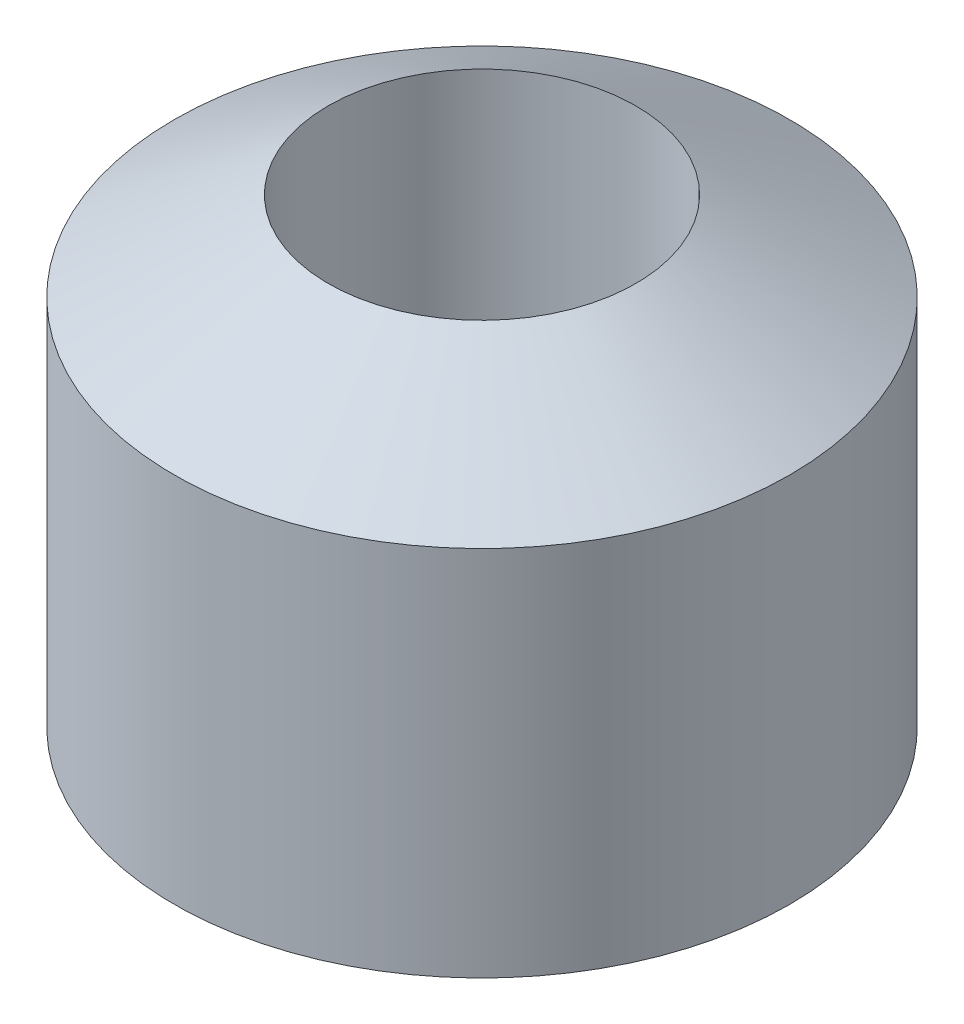
ISO-10303-21;
HEADER;
FILE_DESCRIPTION(('STEP AP214'),'2;1');
FILE_NAME('part.step','',(''),(''),'','','');
FILE_SCHEMA(('AUTOMOTIVE_DESIGN { 1 0 10303 214 1 1 1 1 }'));
ENDSEC;
DATA;
#1=APPLICATION_CONTEXT('core data for automotive mechanical design processes');
#2=APPLICATION_PROTOCOL_DEFINITION('international standard','automotive_design',2000,#1);
#3=PRODUCT_CONTEXT('',#1,'mechanical');
#4=PRODUCT('Part','Part','',(#3));
#5=PRODUCT_RELATED_PRODUCT_CATEGORY('part','',(#4));
#6=PRODUCT_DEFINITION_FORMATION('','',#4);
#7=PRODUCT_DEFINITION_CONTEXT('part definition',#1,'design');
#8=PRODUCT_DEFINITION('design','',#6,#7);
#9=PRODUCT_DEFINITION_SHAPE('','',#8);
#10=(LENGTH_UNIT() NAMED_UNIT(*) SI_UNIT(.MILLI.,.METRE.));
#11=(NAMED_UNIT(*) PLANE_ANGLE_UNIT() SI_UNIT($,.RADIAN.));
#12=(NAMED_UNIT(*) SI_UNIT($,.STERADIAN.) SOLID_ANGLE_UNIT());
#13=UNCERTAINTY_MEASURE_WITH_UNIT(LENGTH_MEASURE(1.E-05),#10,'distance_accuracy_value','');
#14=(GEOMETRIC_REPRESENTATION_CONTEXT(3) GLOBAL_UNCERTAINTY_ASSIGNED_CONTEXT((#13)) GLOBAL_UNIT_ASSIGNED_CONTEXT((#10,
#11,#12)) REPRESENTATION_CONTEXT('',''));
#15=CARTESIAN_POINT('',(0.,0.,0.));
#16=DIRECTION('',(0.,0.,1.));
#17=DIRECTION('',(1.,0.,0.));
#18=AXIS2_PLACEMENT_3D('',#15,#16,#17);
#19=CARTESIAN_POINT('',(0.,41.9170962313452,0.));
#20=DIRECTION('',(0.,-1.,0.));
#21=DIRECTION('',(1.,0.,0.));
#22=AXIS2_PLACEMENT_3D('',#19,#20,#21);
#23=CONICAL_SURFACE('',#22,28.,1.04719755119659);
#24=CARTESIAN_POINT('',(0.,50.,0.));
#25=DIRECTION('',(0.,1.,0.));
#26=DIRECTION('',(-1.,0.,0.));
#27=AXIS2_PLACEMENT_3D('',#24,#25,#26);
#28=CIRCLE('',#27,14.);
#29=CARTESIAN_POINT('',(-14.,50.,0.));
#30=VERTEX_POINT('',#29);
#31=EDGE_CURVE('E10',#30,#30,#28,.T.);
#32=ORIENTED_EDGE('',*,*,#31,.F.);
#33=EDGE_LOOP('',(#32));
#34=FACE_BOUND('',#33,.T.);
#35=CARTESIAN_POINT('',(0.,41.9170962313452,0.));
#36=DIRECTION('',(0.,1.,0.));
#37=DIRECTION('',(-1.,0.,0.));
#38=AXIS2_PLACEMENT_3D('',#35,#36,#37);
#39=CIRCLE('',#38,28.);
#40=CARTESIAN_POINT('',(-28.,41.9170962313452,0.));
#41=VERTEX_POINT('',#40);
#42=EDGE_CURVE('E51',#41,#41,#39,.T.);
#43=ORIENTED_EDGE('',*,*,#42,.T.);
#44=EDGE_LOOP('',(#43));
#45=FACE_BOUND('',#44,.T.);
#46=ADVANCED_FACE('F37',(#34,#45),#23,.T.);
#47=CARTESIAN_POINT('',(0.,3.98022562253338,0.));
#48=DIRECTION('',(0.,1.,0.));
#49=DIRECTION('',(-1.,0.,0.));
#50=AXIS2_PLACEMENT_3D('',#47,#48,#49);
#51=CYLINDRICAL_SURFACE('',#50,14.);
#52=CARTESIAN_POINT('',(0.,0.,0.));
#53=DIRECTION('',(0.,1.,0.));
#54=DIRECTION('',(-1.,0.,0.));
#55=AXIS2_PLACEMENT_3D('',#52,#53,#54);
#56=CIRCLE('',#55,14.);
#57=CARTESIAN_POINT('',(-14.,0.,0.));
#58=VERTEX_POINT('',#57);
#59=EDGE_CURVE('E43',#58,#58,#56,.T.);
#60=ORIENTED_EDGE('',*,*,#59,.F.);
#61=EDGE_LOOP('',(#60));
#62=FACE_BOUND('',#61,.T.);
#63=ORIENTED_EDGE('',*,*,#31,.T.);
#64=EDGE_LOOP('',(#63));
#65=FACE_BOUND('',#64,.T.);
#66=ADVANCED_FACE('F66',(#62,#65),#51,.F.);
#67=CARTESIAN_POINT('',(0.,0.,0.));
#68=DIRECTION('',(0.,1.,0.));
#69=DIRECTION('',(-1.,0.,0.));
#70=AXIS2_PLACEMENT_3D('',#67,#68,#69);
#71=CONICAL_SURFACE('',#70,14.,1.04719755119659);
#72=CARTESIAN_POINT('',(0.,8.08290376865485,0.));
#73=DIRECTION('',(0.,1.,0.));
#74=DIRECTION('',(-1.,0.,0.));
#75=AXIS2_PLACEMENT_3D('',#72,#73,#74);
#76=CIRCLE('',#75,28.);
#77=CARTESIAN_POINT('',(-28.,8.08290376865485,0.));
#78=VERTEX_POINT('',#77);
#79=EDGE_CURVE('E47',#78,#78,#76,.T.);
#80=ORIENTED_EDGE('',*,*,#79,.F.);
#81=EDGE_LOOP('',(#80));
#82=FACE_BOUND('',#81,.T.);
#83=ORIENTED_EDGE('',*,*,#59,.T.);
#84=EDGE_LOOP('',(#83));
#85=FACE_BOUND('',#84,.T.);
#86=ADVANCED_FACE('F61',(#82,#85),#71,.T.);
#87=CARTESIAN_POINT('',(0.,3.98022562253338,0.));
#88=DIRECTION('',(0.,1.,0.));
#89=DIRECTION('',(-1.,0.,0.));
#90=AXIS2_PLACEMENT_3D('',#87,#88,#89);
#91=CYLINDRICAL_SURFACE('',#90,28.);
#92=ORIENTED_EDGE('',*,*,#42,.F.);
#93=EDGE_LOOP('',(#92));
#94=FACE_BOUND('',#93,.T.);
#95=ORIENTED_EDGE('',*,*,#79,.T.);
#96=EDGE_LOOP('',(#95));
#97=FACE_BOUND('',#96,.T.);
#98=ADVANCED_FACE('F58',(#94,#97),#91,.T.);
#99=CLOSED_SHELL('',(#46,#66,#86,#98));
#100=MANIFOLD_SOLID_BREP('B2',#99);
#101=ADVANCED_BREP_SHAPE_REPRESENTATION('',(#18,#100),#14);
#102=SHAPE_DEFINITION_REPRESENTATION(#9,#101);
ENDSEC;
END-ISO-10303-21;
